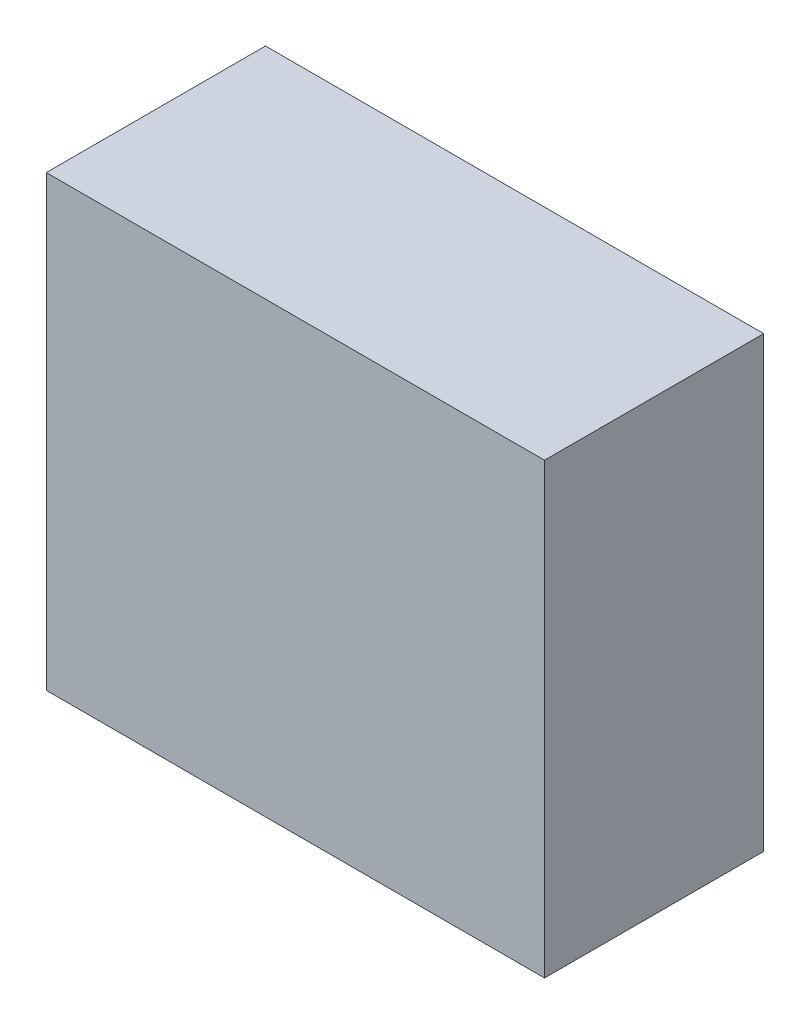
ISO-10303-21;
HEADER;
FILE_DESCRIPTION(('STEP AP214'),'2;1');
FILE_NAME('part.step','',(''),(''),'','','');
FILE_SCHEMA(('AUTOMOTIVE_DESIGN { 1 0 10303 214 1 1 1 1 }'));
ENDSEC;
DATA;
#1=APPLICATION_CONTEXT('core data for automotive mechanical design processes');
#2=APPLICATION_PROTOCOL_DEFINITION('international standard','automotive_design',2000,#1);
#3=PRODUCT_CONTEXT('',#1,'mechanical');
#4=PRODUCT('Part','Part','',(#3));
#5=PRODUCT_RELATED_PRODUCT_CATEGORY('part','',(#4));
#6=PRODUCT_DEFINITION_FORMATION('','',#4);
#7=PRODUCT_DEFINITION_CONTEXT('part definition',#1,'design');
#8=PRODUCT_DEFINITION('design','',#6,#7);
#9=PRODUCT_DEFINITION_SHAPE('','',#8);
#10=(LENGTH_UNIT() NAMED_UNIT(*) SI_UNIT(.MILLI.,.METRE.));
#11=(NAMED_UNIT(*) PLANE_ANGLE_UNIT() SI_UNIT($,.RADIAN.));
#12=(NAMED_UNIT(*) SI_UNIT($,.STERADIAN.) SOLID_ANGLE_UNIT());
#13=UNCERTAINTY_MEASURE_WITH_UNIT(LENGTH_MEASURE(1.E-05),#10,'distance_accuracy_value','');
#14=(GEOMETRIC_REPRESENTATION_CONTEXT(3) GLOBAL_UNCERTAINTY_ASSIGNED_CONTEXT((#13)) GLOBAL_UNIT_ASSIGNED_CONTEXT((#10,
#11,#12)) REPRESENTATION_CONTEXT('',''));
#15=CARTESIAN_POINT('',(0.,0.,0.));
#16=DIRECTION('',(0.,0.,1.));
#17=DIRECTION('',(1.,0.,0.));
#18=AXIS2_PLACEMENT_3D('',#15,#16,#17);
#19=CARTESIAN_POINT('',(0.,0.,44.));
#20=DIRECTION('',(1.,0.,0.));
#21=DIRECTION('',(0.,0.,-1.));
#22=AXIS2_PLACEMENT_3D('',#19,#20,#21);
#23=PLANE('',#22);
#24=DIRECTION('',(0.,-1.,0.));
#25=VECTOR('',#24,1.);
#26=CARTESIAN_POINT('',(0.,0.,0.));
#27=LINE('',#26,#25);
#28=CARTESIAN_POINT('',(0.,90.,0.));
#29=VERTEX_POINT('',#28);
#30=CARTESIAN_POINT('',(0.,0.,0.));
#31=VERTEX_POINT('',#30);
#32=EDGE_CURVE('E108',#29,#31,#27,.T.);
#33=ORIENTED_EDGE('',*,*,#32,.T.);
#34=DIRECTION('',(0.,0.,-1.));
#35=VECTOR('',#34,1.);
#36=CARTESIAN_POINT('',(0.,0.,44.));
#37=LINE('',#36,#35);
#38=CARTESIAN_POINT('',(0.,0.,44.));
#39=VERTEX_POINT('',#38);
#40=EDGE_CURVE('E11',#39,#31,#37,.T.);
#41=ORIENTED_EDGE('',*,*,#40,.F.);
#42=DIRECTION('',(0.,-1.,0.));
#43=VECTOR('',#42,1.);
#44=CARTESIAN_POINT('',(0.,0.,44.));
#45=LINE('',#44,#43);
#46=CARTESIAN_POINT('',(0.,90.,44.));
#47=VERTEX_POINT('',#46);
#48=EDGE_CURVE('E92',#47,#39,#45,.T.);
#49=ORIENTED_EDGE('',*,*,#48,.F.);
#50=DIRECTION('',(0.,0.,-1.));
#51=VECTOR('',#50,1.);
#52=CARTESIAN_POINT('',(0.,90.,44.));
#53=LINE('',#52,#51);
#54=EDGE_CURVE('E105',#47,#29,#53,.T.);
#55=ORIENTED_EDGE('',*,*,#54,.T.);
#56=EDGE_LOOP('',(#33,#41,#49,#55));
#57=FACE_BOUND('',#56,.T.);
#58=ADVANCED_FACE('F43',(#57),#23,.F.);
#59=CARTESIAN_POINT('',(0.,0.,44.));
#60=DIRECTION('',(0.,1.,0.));
#61=DIRECTION('',(0.,0.,1.));
#62=AXIS2_PLACEMENT_3D('',#59,#60,#61);
#63=PLANE('',#62);
#64=DIRECTION('',(1.,0.,0.));
#65=VECTOR('',#64,1.);
#66=CARTESIAN_POINT('',(0.,0.,0.));
#67=LINE('',#66,#65);
#68=CARTESIAN_POINT('',(100.,0.,0.));
#69=VERTEX_POINT('',#68);
#70=EDGE_CURVE('E97',#31,#69,#67,.T.);
#71=ORIENTED_EDGE('',*,*,#70,.T.);
#72=DIRECTION('',(0.,0.,-1.));
#73=VECTOR('',#72,1.);
#74=CARTESIAN_POINT('',(100.,0.,44.));
#75=LINE('',#74,#73);
#76=CARTESIAN_POINT('',(100.,0.,44.));
#77=VERTEX_POINT('',#76);
#78=EDGE_CURVE('E51',#77,#69,#75,.T.);
#79=ORIENTED_EDGE('',*,*,#78,.F.);
#80=DIRECTION('',(1.,0.,0.));
#81=VECTOR('',#80,1.);
#82=CARTESIAN_POINT('',(0.,0.,44.));
#83=LINE('',#82,#81);
#84=EDGE_CURVE('E87',#39,#77,#83,.T.);
#85=ORIENTED_EDGE('',*,*,#84,.F.);
#86=ORIENTED_EDGE('',*,*,#40,.T.);
#87=EDGE_LOOP('',(#71,#79,#85,#86));
#88=FACE_BOUND('',#87,.T.);
#89=ADVANCED_FACE('F100',(#88),#63,.F.);
#90=CARTESIAN_POINT('',(100.,0.,44.));
#91=DIRECTION('',(-1.,0.,0.));
#92=DIRECTION('',(0.,0.,1.));
#93=AXIS2_PLACEMENT_3D('',#90,#91,#92);
#94=PLANE('',#93);
#95=DIRECTION('',(0.,1.,0.));
#96=VECTOR('',#95,1.);
#97=CARTESIAN_POINT('',(100.,0.,0.));
#98=LINE('',#97,#96);
#99=CARTESIAN_POINT('',(100.,90.,0.));
#100=VERTEX_POINT('',#99);
#101=EDGE_CURVE('E78',#69,#100,#98,.T.);
#102=ORIENTED_EDGE('',*,*,#101,.T.);
#103=DIRECTION('',(0.,0.,-1.));
#104=VECTOR('',#103,1.);
#105=CARTESIAN_POINT('',(100.,90.,44.));
#106=LINE('',#105,#104);
#107=CARTESIAN_POINT('',(100.,90.,44.));
#108=VERTEX_POINT('',#107);
#109=EDGE_CURVE('E98',#108,#100,#106,.T.);
#110=ORIENTED_EDGE('',*,*,#109,.F.);
#111=DIRECTION('',(0.,1.,0.));
#112=VECTOR('',#111,1.);
#113=CARTESIAN_POINT('',(100.,0.,44.));
#114=LINE('',#113,#112);
#115=EDGE_CURVE('E95',#77,#108,#114,.T.);
#116=ORIENTED_EDGE('',*,*,#115,.F.);
#117=ORIENTED_EDGE('',*,*,#78,.T.);
#118=EDGE_LOOP('',(#102,#110,#116,#117));
#119=FACE_BOUND('',#118,.T.);
#120=ADVANCED_FACE('F99',(#119),#94,.F.);
#121=CARTESIAN_POINT('',(0.,90.,44.));
#122=DIRECTION('',(0.,-1.,0.));
#123=DIRECTION('',(0.,0.,-1.));
#124=AXIS2_PLACEMENT_3D('',#121,#122,#123);
#125=PLANE('',#124);
#126=DIRECTION('',(-1.,0.,0.));
#127=VECTOR('',#126,1.);
#128=CARTESIAN_POINT('',(0.,90.,0.));
#129=LINE('',#128,#127);
#130=EDGE_CURVE('E85',#100,#29,#129,.T.);
#131=ORIENTED_EDGE('',*,*,#130,.T.);
#132=ORIENTED_EDGE('',*,*,#54,.F.);
#133=DIRECTION('',(-1.,0.,0.));
#134=VECTOR('',#133,1.);
#135=CARTESIAN_POINT('',(0.,90.,44.));
#136=LINE('',#135,#134);
#137=EDGE_CURVE('E56',#108,#47,#136,.T.);
#138=ORIENTED_EDGE('',*,*,#137,.F.);
#139=ORIENTED_EDGE('',*,*,#109,.T.);
#140=EDGE_LOOP('',(#131,#132,#138,#139));
#141=FACE_BOUND('',#140,.T.);
#142=ADVANCED_FACE('F111',(#141),#125,.F.);
#143=CARTESIAN_POINT('',(0.,0.,44.));
#144=DIRECTION('',(0.,0.,-1.));
#145=DIRECTION('',(-1.,0.,0.));
#146=AXIS2_PLACEMENT_3D('',#143,#144,#145);
#147=PLANE('',#146);
#148=ORIENTED_EDGE('',*,*,#48,.T.);
#149=ORIENTED_EDGE('',*,*,#84,.T.);
#150=ORIENTED_EDGE('',*,*,#115,.T.);
#151=ORIENTED_EDGE('',*,*,#137,.T.);
#152=EDGE_LOOP('',(#148,#149,#150,#151));
#153=FACE_BOUND('',#152,.T.);
#154=ADVANCED_FACE('F89',(#153),#147,.F.);
#155=CARTESIAN_POINT('',(0.,0.,0.));
#156=DIRECTION('',(0.,0.,-1.));
#157=DIRECTION('',(-1.,0.,0.));
#158=AXIS2_PLACEMENT_3D('',#155,#156,#157);
#159=PLANE('',#158);
#160=ORIENTED_EDGE('',*,*,#32,.F.);
#161=ORIENTED_EDGE('',*,*,#130,.F.);
#162=ORIENTED_EDGE('',*,*,#101,.F.);
#163=ORIENTED_EDGE('',*,*,#70,.F.);
#164=EDGE_LOOP('',(#160,#161,#162,#163));
#165=FACE_BOUND('',#164,.T.);
#166=ADVANCED_FACE('F118',(#165),#159,.T.);
#167=CLOSED_SHELL('',(#58,#89,#120,#142,#154,#166));
#168=MANIFOLD_SOLID_BREP('B2',#167);
#169=ADVANCED_BREP_SHAPE_REPRESENTATION('',(#18,#168),#14);
#170=SHAPE_DEFINITION_REPRESENTATION(#9,#169);
ENDSEC;
END-ISO-10303-21;
